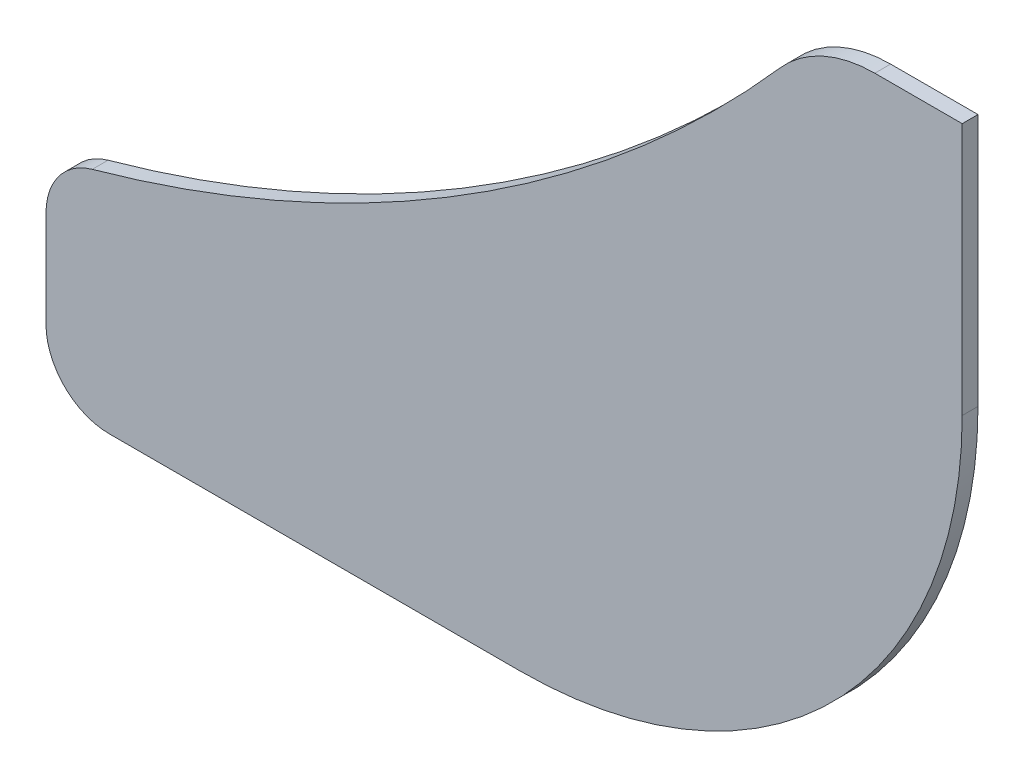
ISO-10303-21;
HEADER;
FILE_DESCRIPTION(('STEP AP214'),'2;1');
FILE_NAME('part.step','',(''),(''),'','','');
FILE_SCHEMA(('AUTOMOTIVE_DESIGN { 1 0 10303 214 1 1 1 1 }'));
ENDSEC;
DATA;
#1=APPLICATION_CONTEXT('core data for automotive mechanical design processes');
#2=APPLICATION_PROTOCOL_DEFINITION('international standard','automotive_design',2000,#1);
#3=PRODUCT_CONTEXT('',#1,'mechanical');
#4=PRODUCT('Part','Part','',(#3));
#5=PRODUCT_RELATED_PRODUCT_CATEGORY('part','',(#4));
#6=PRODUCT_DEFINITION_FORMATION('','',#4);
#7=PRODUCT_DEFINITION_CONTEXT('part definition',#1,'design');
#8=PRODUCT_DEFINITION('design','',#6,#7);
#9=PRODUCT_DEFINITION_SHAPE('','',#8);
#10=(LENGTH_UNIT() NAMED_UNIT(*) SI_UNIT(.MILLI.,.METRE.));
#11=(NAMED_UNIT(*) PLANE_ANGLE_UNIT() SI_UNIT($,.RADIAN.));
#12=(NAMED_UNIT(*) SI_UNIT($,.STERADIAN.) SOLID_ANGLE_UNIT());
#13=UNCERTAINTY_MEASURE_WITH_UNIT(LENGTH_MEASURE(1.E-05),#10,'distance_accuracy_value','');
#14=(GEOMETRIC_REPRESENTATION_CONTEXT(3) GLOBAL_UNCERTAINTY_ASSIGNED_CONTEXT((#13)) GLOBAL_UNIT_ASSIGNED_CONTEXT((#10,
#11,#12)) REPRESENTATION_CONTEXT('',''));
#15=CARTESIAN_POINT('',(0.,0.,0.));
#16=DIRECTION('',(0.,0.,1.));
#17=DIRECTION('',(1.,0.,0.));
#18=AXIS2_PLACEMENT_3D('',#15,#16,#17);
#19=CARTESIAN_POINT('',(0.,-7.62000000000002,6.35));
#20=DIRECTION('',(0.,-1.,0.));
#21=DIRECTION('',(0.,0.,-1.));
#22=AXIS2_PLACEMENT_3D('',#19,#20,#21);
#23=PLANE('',#22);
#24=DIRECTION('',(-1.,0.,0.));
#25=VECTOR('',#24,1.);
#26=CARTESIAN_POINT('',(0.,-7.62000000000002,0.));
#27=LINE('',#26,#25);
#28=CARTESIAN_POINT('',(571.471225938193,-7.62000000000002,0.));
#29=VERTEX_POINT('',#28);
#30=CARTESIAN_POINT('',(536.34638307089,-7.62000000000002,0.));
#31=VERTEX_POINT('',#30);
#32=EDGE_CURVE('E129',#29,#31,#27,.T.);
#33=ORIENTED_EDGE('',*,*,#32,.T.);
#34=DIRECTION('',(0.,0.,-1.));
#35=VECTOR('',#34,1.);
#36=CARTESIAN_POINT('',(536.34638307089,-7.62000000000002,6.35));
#37=LINE('',#36,#35);
#38=CARTESIAN_POINT('',(536.34638307089,-7.62000000000002,6.35));
#39=VERTEX_POINT('',#38);
#40=EDGE_CURVE('E110',#39,#31,#37,.T.);
#41=ORIENTED_EDGE('',*,*,#40,.F.);
#42=DIRECTION('',(-1.,0.,0.));
#43=VECTOR('',#42,1.);
#44=CARTESIAN_POINT('',(0.,-7.62000000000002,6.35));
#45=LINE('',#44,#43);
#46=CARTESIAN_POINT('',(571.471225938193,-7.62000000000002,6.35));
#47=VERTEX_POINT('',#46);
#48=EDGE_CURVE('E116',#47,#39,#45,.T.);
#49=ORIENTED_EDGE('',*,*,#48,.F.);
#50=DIRECTION('',(0.,0.,-1.));
#51=VECTOR('',#50,1.);
#52=CARTESIAN_POINT('',(571.471225938193,-7.62000000000002,6.35));
#53=LINE('',#52,#51);
#54=EDGE_CURVE('E147',#47,#29,#53,.T.);
#55=ORIENTED_EDGE('',*,*,#54,.T.);
#56=EDGE_LOOP('',(#33,#41,#49,#55));
#57=FACE_BOUND('',#56,.T.);
#58=ADVANCED_FACE('F35',(#57),#23,.F.);
#59=CARTESIAN_POINT('',(536.34638307089,-58.42,6.35));
#60=DIRECTION('',(0.,0.,-1.));
#61=DIRECTION('',(-1.,0.,0.));
#62=AXIS2_PLACEMENT_3D('',#59,#60,#61);
#63=CYLINDRICAL_SURFACE('',#62,50.8000000000001);
#64=CARTESIAN_POINT('',(536.34638307089,-58.42,0.));
#65=DIRECTION('',(0.,0.,1.));
#66=DIRECTION('',(1.,0.,0.));
#67=AXIS2_PLACEMENT_3D('',#64,#65,#66);
#68=CIRCLE('',#67,50.8000000000001);
#69=CARTESIAN_POINT('',(498.198486457985,-24.8733461577603,0.));
#70=VERTEX_POINT('',#69);
#71=EDGE_CURVE('E162',#31,#70,#68,.T.);
#72=ORIENTED_EDGE('',*,*,#71,.T.);
#73=DIRECTION('',(0.,0.,-1.));
#74=VECTOR('',#73,1.);
#75=CARTESIAN_POINT('',(498.198486457985,-24.8733461577603,6.35));
#76=LINE('',#75,#74);
#77=CARTESIAN_POINT('',(498.198486457985,-24.8733461577603,6.35));
#78=VERTEX_POINT('',#77);
#79=EDGE_CURVE('E113',#78,#70,#76,.T.);
#80=ORIENTED_EDGE('',*,*,#79,.F.);
#81=CARTESIAN_POINT('',(536.34638307089,-58.42,6.35));
#82=DIRECTION('',(0.,0.,1.));
#83=DIRECTION('',(1.,0.,0.));
#84=AXIS2_PLACEMENT_3D('',#81,#82,#83);
#85=CIRCLE('',#84,50.8000000000001);
#86=EDGE_CURVE('E105',#39,#78,#85,.T.);
#87=ORIENTED_EDGE('',*,*,#86,.F.);
#88=ORIENTED_EDGE('',*,*,#40,.T.);
#89=EDGE_LOOP('',(#72,#80,#87,#88));
#90=FACE_BOUND('',#89,.T.);
#91=ADVANCED_FACE('F108',(#90),#63,.T.);
#92=CARTESIAN_POINT('',(68.2384296997134,353.226692657483,6.35));
#93=DIRECTION('',(0.,0.,-1.));
#94=DIRECTION('',(-1.,0.,0.));
#95=AXIS2_PLACEMENT_3D('',#92,#93,#94);
#96=CYLINDRICAL_SURFACE('',#95,572.560293558385);
#97=CARTESIAN_POINT('',(68.2384296997134,353.226692657483,0.));
#98=DIRECTION('',(0.,0.,1.));
#99=DIRECTION('',(1.,0.,0.));
#100=AXIS2_PLACEMENT_3D('',#97,#98,#99);
#101=CIRCLE('',#100,572.560293558385);
#102=CARTESIAN_POINT('',(221.788203414999,-198.359888716329,0.));
#103=VERTEX_POINT('',#102);
#104=EDGE_CURVE('E160',#103,#70,#101,.T.);
#105=ORIENTED_EDGE('',*,*,#104,.F.);
#106=DIRECTION('',(0.,0.,-1.));
#107=VECTOR('',#106,1.);
#108=CARTESIAN_POINT('',(221.788203414999,-198.359888716329,6.35));
#109=LINE('',#108,#107);
#110=CARTESIAN_POINT('',(221.788203414999,-198.359888716329,6.35));
#111=VERTEX_POINT('',#110);
#112=EDGE_CURVE('E43',#103,#111,#109,.F.);
#113=ORIENTED_EDGE('',*,*,#112,.T.);
#114=CARTESIAN_POINT('',(68.2384296997134,353.226692657483,6.35));
#115=DIRECTION('',(0.,0.,1.));
#116=DIRECTION('',(1.,0.,0.));
#117=AXIS2_PLACEMENT_3D('',#114,#115,#116);
#118=CIRCLE('',#117,572.560293558385);
#119=EDGE_CURVE('E115',#111,#78,#118,.T.);
#120=ORIENTED_EDGE('',*,*,#119,.T.);
#121=ORIENTED_EDGE('',*,*,#79,.T.);
#122=EDGE_LOOP('',(#105,#113,#120,#121));
#123=FACE_BOUND('',#122,.T.);
#124=ADVANCED_FACE('F175',(#123),#96,.F.);
#125=CARTESIAN_POINT('',(203.2,0.,6.35));
#126=DIRECTION('',(1.,0.,0.));
#127=DIRECTION('',(0.,1.,0.));
#128=AXIS2_PLACEMENT_3D('',#125,#126,#127);
#129=PLANE('',#128);
#130=DIRECTION('',(0.,-1.,0.));
#131=VECTOR('',#130,1.);
#132=CARTESIAN_POINT('',(203.2,0.,6.35));
#133=LINE('',#132,#131);
#134=CARTESIAN_POINT('',(203.2,-222.829449956461,6.35));
#135=VERTEX_POINT('',#134);
#136=CARTESIAN_POINT('',(203.2,-261.62,6.35));
#137=VERTEX_POINT('',#136);
#138=EDGE_CURVE('E173',#135,#137,#133,.T.);
#139=ORIENTED_EDGE('',*,*,#138,.F.);
#140=DIRECTION('',(0.,0.,1.));
#141=VECTOR('',#140,1.);
#142=CARTESIAN_POINT('',(203.2,-222.829449956461,0.));
#143=LINE('',#142,#141);
#144=CARTESIAN_POINT('',(203.2,-222.829449956461,0.));
#145=VERTEX_POINT('',#144);
#146=EDGE_CURVE('E130',#135,#145,#143,.F.);
#147=ORIENTED_EDGE('',*,*,#146,.T.);
#148=DIRECTION('',(0.,-1.,0.));
#149=VECTOR('',#148,1.);
#150=CARTESIAN_POINT('',(203.2,0.,0.));
#151=LINE('',#150,#149);
#152=CARTESIAN_POINT('',(203.2,-261.62,0.));
#153=VERTEX_POINT('',#152);
#154=EDGE_CURVE('E158',#145,#153,#151,.T.);
#155=ORIENTED_EDGE('',*,*,#154,.T.);
#156=DIRECTION('',(0.,0.,-1.));
#157=VECTOR('',#156,1.);
#158=CARTESIAN_POINT('',(203.2,-261.62,6.35));
#159=LINE('',#158,#157);
#160=EDGE_CURVE('E134',#137,#153,#159,.T.);
#161=ORIENTED_EDGE('',*,*,#160,.F.);
#162=EDGE_LOOP('',(#139,#147,#155,#161));
#163=FACE_BOUND('',#162,.T.);
#164=ADVANCED_FACE('F181',(#163),#129,.F.);
#165=CARTESIAN_POINT('',(228.6,-261.62,6.35));
#166=DIRECTION('',(0.,0.,-1.));
#167=DIRECTION('',(-1.,0.,0.));
#168=AXIS2_PLACEMENT_3D('',#165,#166,#167);
#169=CYLINDRICAL_SURFACE('',#168,25.4);
#170=CARTESIAN_POINT('',(228.6,-261.62,0.));
#171=DIRECTION('',(0.,0.,1.));
#172=DIRECTION('',(1.,0.,0.));
#173=AXIS2_PLACEMENT_3D('',#170,#171,#172);
#174=CIRCLE('',#173,25.4);
#175=CARTESIAN_POINT('',(228.6,-287.02,0.));
#176=VERTEX_POINT('',#175);
#177=EDGE_CURVE('E156',#153,#176,#174,.T.);
#178=ORIENTED_EDGE('',*,*,#177,.T.);
#179=DIRECTION('',(0.,0.,-1.));
#180=VECTOR('',#179,1.);
#181=CARTESIAN_POINT('',(228.6,-287.02,6.35));
#182=LINE('',#181,#180);
#183=CARTESIAN_POINT('',(228.6,-287.02,6.35));
#184=VERTEX_POINT('',#183);
#185=EDGE_CURVE('E140',#184,#176,#182,.T.);
#186=ORIENTED_EDGE('',*,*,#185,.F.);
#187=CARTESIAN_POINT('',(228.6,-261.62,6.35));
#188=DIRECTION('',(0.,0.,1.));
#189=DIRECTION('',(1.,0.,0.));
#190=AXIS2_PLACEMENT_3D('',#187,#188,#189);
#191=CIRCLE('',#190,25.4);
#192=EDGE_CURVE('E171',#137,#184,#191,.T.);
#193=ORIENTED_EDGE('',*,*,#192,.F.);
#194=ORIENTED_EDGE('',*,*,#160,.T.);
#195=EDGE_LOOP('',(#178,#186,#193,#194));
#196=FACE_BOUND('',#195,.T.);
#197=ADVANCED_FACE('F188',(#196),#169,.T.);
#198=CARTESIAN_POINT('',(0.,-287.02,6.35));
#199=DIRECTION('',(0.,1.,0.));
#200=DIRECTION('',(-1.,0.,0.));
#201=AXIS2_PLACEMENT_3D('',#198,#199,#200);
#202=PLANE('',#201);
#203=DIRECTION('',(1.,0.,0.));
#204=VECTOR('',#203,1.);
#205=CARTESIAN_POINT('',(0.,-287.02,0.));
#206=LINE('',#205,#204);
#207=CARTESIAN_POINT('',(393.671225938193,-287.02,0.));
#208=VERTEX_POINT('',#207);
#209=EDGE_CURVE('E153',#176,#208,#206,.T.);
#210=ORIENTED_EDGE('',*,*,#209,.T.);
#211=DIRECTION('',(0.,0.,-1.));
#212=VECTOR('',#211,1.);
#213=CARTESIAN_POINT('',(393.671225938193,-287.02,6.35));
#214=LINE('',#213,#212);
#215=CARTESIAN_POINT('',(393.671225938193,-287.02,6.35));
#216=VERTEX_POINT('',#215);
#217=EDGE_CURVE('E143',#216,#208,#214,.T.);
#218=ORIENTED_EDGE('',*,*,#217,.F.);
#219=DIRECTION('',(1.,0.,0.));
#220=VECTOR('',#219,1.);
#221=CARTESIAN_POINT('',(0.,-287.02,6.35));
#222=LINE('',#221,#220);
#223=EDGE_CURVE('E169',#184,#216,#222,.T.);
#224=ORIENTED_EDGE('',*,*,#223,.F.);
#225=ORIENTED_EDGE('',*,*,#185,.T.);
#226=EDGE_LOOP('',(#210,#218,#224,#225));
#227=FACE_BOUND('',#226,.T.);
#228=ADVANCED_FACE('F192',(#227),#202,.F.);
#229=CARTESIAN_POINT('',(393.671225938193,-109.22,6.35));
#230=DIRECTION('',(0.,0.,-1.));
#231=DIRECTION('',(-1.,0.,0.));
#232=AXIS2_PLACEMENT_3D('',#229,#230,#231);
#233=CYLINDRICAL_SURFACE('',#232,177.8);
#234=CARTESIAN_POINT('',(393.671225938193,-109.22,0.));
#235=DIRECTION('',(0.,0.,1.));
#236=DIRECTION('',(1.,0.,0.));
#237=AXIS2_PLACEMENT_3D('',#234,#235,#236);
#238=CIRCLE('',#237,177.8);
#239=CARTESIAN_POINT('',(571.471225938193,-109.22,0.));
#240=VERTEX_POINT('',#239);
#241=EDGE_CURVE('E150',#240,#208,#238,.F.);
#242=ORIENTED_EDGE('',*,*,#241,.F.);
#243=DIRECTION('',(0.,0.,-1.));
#244=VECTOR('',#243,1.);
#245=CARTESIAN_POINT('',(571.471225938193,-109.22,6.35));
#246=LINE('',#245,#244);
#247=CARTESIAN_POINT('',(571.471225938193,-109.22,6.35));
#248=VERTEX_POINT('',#247);
#249=EDGE_CURVE('E145',#248,#240,#246,.T.);
#250=ORIENTED_EDGE('',*,*,#249,.F.);
#251=CARTESIAN_POINT('',(393.671225938193,-109.22,6.35));
#252=DIRECTION('',(0.,0.,1.));
#253=DIRECTION('',(1.,0.,0.));
#254=AXIS2_PLACEMENT_3D('',#251,#252,#253);
#255=CIRCLE('',#254,177.8);
#256=EDGE_CURVE('E166',#248,#216,#255,.F.);
#257=ORIENTED_EDGE('',*,*,#256,.T.);
#258=ORIENTED_EDGE('',*,*,#217,.T.);
#259=EDGE_LOOP('',(#242,#250,#257,#258));
#260=FACE_BOUND('',#259,.T.);
#261=ADVANCED_FACE('F196',(#260),#233,.T.);
#262=CARTESIAN_POINT('',(571.471225938193,6.24469008806444E-13,6.35));
#263=DIRECTION('',(-1.,0.,0.));
#264=DIRECTION('',(0.,-1.,0.));
#265=AXIS2_PLACEMENT_3D('',#262,#263,#264);
#266=PLANE('',#265);
#267=DIRECTION('',(0.,1.,0.));
#268=VECTOR('',#267,1.);
#269=CARTESIAN_POINT('',(571.471225938193,6.24469008806444E-13,0.));
#270=LINE('',#269,#268);
#271=EDGE_CURVE('E126',#240,#29,#270,.T.);
#272=ORIENTED_EDGE('',*,*,#271,.T.);
#273=ORIENTED_EDGE('',*,*,#54,.F.);
#274=DIRECTION('',(0.,1.,0.));
#275=VECTOR('',#274,1.);
#276=CARTESIAN_POINT('',(571.471225938193,6.24469008806444E-13,6.35));
#277=LINE('',#276,#275);
#278=EDGE_CURVE('E122',#248,#47,#277,.T.);
#279=ORIENTED_EDGE('',*,*,#278,.F.);
#280=ORIENTED_EDGE('',*,*,#249,.T.);
#281=EDGE_LOOP('',(#272,#273,#279,#280));
#282=FACE_BOUND('',#281,.T.);
#283=ADVANCED_FACE('F199',(#282),#266,.F.);
#284=CARTESIAN_POINT('',(0.,0.,6.35));
#285=DIRECTION('',(0.,0.,1.));
#286=DIRECTION('',(1.,0.,0.));
#287=AXIS2_PLACEMENT_3D('',#284,#285,#286);
#288=PLANE('',#287);
#289=ORIENTED_EDGE('',*,*,#119,.F.);
#290=CARTESIAN_POINT('',(228.6,-222.829449956461,6.35));
#291=DIRECTION('',(0.,0.,1.));
#292=DIRECTION('',(1.,0.,0.));
#293=AXIS2_PLACEMENT_3D('',#290,#291,#292);
#294=CIRCLE('',#293,25.4);
#295=EDGE_CURVE('E11',#111,#135,#294,.T.);
#296=ORIENTED_EDGE('',*,*,#295,.T.);
#297=ORIENTED_EDGE('',*,*,#138,.T.);
#298=ORIENTED_EDGE('',*,*,#192,.T.);
#299=ORIENTED_EDGE('',*,*,#223,.T.);
#300=ORIENTED_EDGE('',*,*,#256,.F.);
#301=ORIENTED_EDGE('',*,*,#278,.T.);
#302=ORIENTED_EDGE('',*,*,#48,.T.);
#303=ORIENTED_EDGE('',*,*,#86,.T.);
#304=EDGE_LOOP('',(#289,#296,#297,#298,#299,#300,#301,#302,#303));
#305=FACE_BOUND('',#304,.T.);
#306=ADVANCED_FACE('F119',(#305),#288,.T.);
#307=CARTESIAN_POINT('',(0.,0.,0.));
#308=DIRECTION('',(0.,0.,1.));
#309=DIRECTION('',(1.,0.,0.));
#310=AXIS2_PLACEMENT_3D('',#307,#308,#309);
#311=PLANE('',#310);
#312=ORIENTED_EDGE('',*,*,#154,.F.);
#313=CARTESIAN_POINT('',(228.6,-222.829449956461,0.));
#314=DIRECTION('',(0.,0.,1.));
#315=DIRECTION('',(1.,0.,0.));
#316=AXIS2_PLACEMENT_3D('',#313,#314,#315);
#317=CIRCLE('',#316,25.4);
#318=EDGE_CURVE('E57',#145,#103,#317,.F.);
#319=ORIENTED_EDGE('',*,*,#318,.T.);
#320=ORIENTED_EDGE('',*,*,#104,.T.);
#321=ORIENTED_EDGE('',*,*,#71,.F.);
#322=ORIENTED_EDGE('',*,*,#32,.F.);
#323=ORIENTED_EDGE('',*,*,#271,.F.);
#324=ORIENTED_EDGE('',*,*,#241,.T.);
#325=ORIENTED_EDGE('',*,*,#209,.F.);
#326=ORIENTED_EDGE('',*,*,#177,.F.);
#327=EDGE_LOOP('',(#312,#319,#320,#321,#322,#323,#324,#325,#326));
#328=FACE_BOUND('',#327,.T.);
#329=ADVANCED_FACE('F184',(#328),#311,.F.);
#330=CARTESIAN_POINT('',(228.6,-222.829449956461,6.35));
#331=DIRECTION('',(0.,0.,-1.));
#332=DIRECTION('',(-1.,0.,0.));
#333=AXIS2_PLACEMENT_3D('',#330,#331,#332);
#334=CYLINDRICAL_SURFACE('',#333,25.4);
#335=ORIENTED_EDGE('',*,*,#295,.F.);
#336=ORIENTED_EDGE('',*,*,#112,.F.);
#337=ORIENTED_EDGE('',*,*,#318,.F.);
#338=ORIENTED_EDGE('',*,*,#146,.F.);
#339=EDGE_LOOP('',(#335,#336,#337,#338));
#340=FACE_BOUND('',#339,.T.);
#341=ADVANCED_FACE('F37',(#340),#334,.T.);
#342=CLOSED_SHELL('',(#58,#91,#124,#164,#197,#228,#261,#283,#306,#329,#341));
#343=MANIFOLD_SOLID_BREP('B2',#342);
#344=ADVANCED_BREP_SHAPE_REPRESENTATION('',(#18,#343),#14);
#345=SHAPE_DEFINITION_REPRESENTATION(#9,#344);
ENDSEC;
END-ISO-10303-21;
